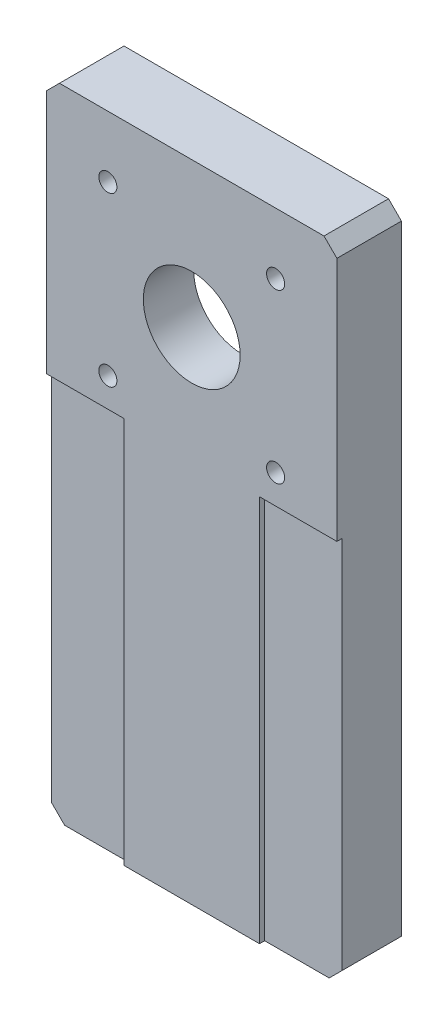
ISO-10303-21;
HEADER;
FILE_DESCRIPTION(('STEP AP214'),'2;1');
FILE_NAME('part.step','',(''),(''),'','','');
FILE_SCHEMA(('AUTOMOTIVE_DESIGN { 1 0 10303 214 1 1 1 1 }'));
ENDSEC;
DATA;
#1=APPLICATION_CONTEXT('core data for automotive mechanical design processes');
#2=APPLICATION_PROTOCOL_DEFINITION('international standard','automotive_design',2000,#1);
#3=PRODUCT_CONTEXT('',#1,'mechanical');
#4=PRODUCT('Part','Part','',(#3));
#5=PRODUCT_RELATED_PRODUCT_CATEGORY('part','',(#4));
#6=PRODUCT_DEFINITION_FORMATION('','',#4);
#7=PRODUCT_DEFINITION_CONTEXT('part definition',#1,'design');
#8=PRODUCT_DEFINITION('design','',#6,#7);
#9=PRODUCT_DEFINITION_SHAPE('','',#8);
#10=(LENGTH_UNIT() NAMED_UNIT(*) SI_UNIT(.MILLI.,.METRE.));
#11=(NAMED_UNIT(*) PLANE_ANGLE_UNIT() SI_UNIT($,.RADIAN.));
#12=(NAMED_UNIT(*) SI_UNIT($,.STERADIAN.) SOLID_ANGLE_UNIT());
#13=UNCERTAINTY_MEASURE_WITH_UNIT(LENGTH_MEASURE(1.E-05),#10,'distance_accuracy_value','');
#14=(GEOMETRIC_REPRESENTATION_CONTEXT(3) GLOBAL_UNCERTAINTY_ASSIGNED_CONTEXT((#13)) GLOBAL_UNIT_ASSIGNED_CONTEXT((#10,
#11,#12)) REPRESENTATION_CONTEXT('',''));
#15=CARTESIAN_POINT('',(0.,0.,0.));
#16=DIRECTION('',(0.,0.,1.));
#17=DIRECTION('',(1.,0.,0.));
#18=AXIS2_PLACEMENT_3D('',#15,#16,#17);
#19=CARTESIAN_POINT('',(22.5,77.5,0.));
#20=DIRECTION('',(0.,0.,1.));
#21=DIRECTION('',(1.,0.,0.));
#22=AXIS2_PLACEMENT_3D('',#19,#20,#21);
#23=CYLINDRICAL_SURFACE('',#22,7.5);
#24=CARTESIAN_POINT('',(22.5,77.5,10.));
#25=DIRECTION('',(0.,0.,1.));
#26=DIRECTION('',(1.,0.,0.));
#27=AXIS2_PLACEMENT_3D('',#24,#25,#26);
#28=CIRCLE('',#27,7.5);
#29=CARTESIAN_POINT('',(30.,77.5,10.));
#30=VERTEX_POINT('',#29);
#31=EDGE_CURVE('E208',#30,#30,#28,.T.);
#32=ORIENTED_EDGE('',*,*,#31,.T.);
#33=EDGE_LOOP('',(#32));
#34=FACE_BOUND('',#33,.T.);
#35=CARTESIAN_POINT('',(22.5,77.5,2.2));
#36=DIRECTION('',(0.,0.,-1.));
#37=DIRECTION('',(-1.,0.,0.));
#38=AXIS2_PLACEMENT_3D('',#35,#36,#37);
#39=CIRCLE('',#38,7.5);
#40=CARTESIAN_POINT('',(15.,77.5,2.2));
#41=VERTEX_POINT('',#40);
#42=EDGE_CURVE('E201',#41,#41,#39,.F.);
#43=ORIENTED_EDGE('',*,*,#42,.F.);
#44=EDGE_LOOP('',(#43));
#45=FACE_BOUND('',#44,.T.);
#46=ADVANCED_FACE('F39',(#34,#45),#23,.F.);
#47=CARTESIAN_POINT('',(0.,0.,10.));
#48=DIRECTION('',(1.,0.,0.));
#49=DIRECTION('',(0.,0.,-1.));
#50=AXIS2_PLACEMENT_3D('',#47,#48,#49);
#51=PLANE('',#50);
#52=DIRECTION('',(0.,-1.,0.));
#53=VECTOR('',#52,1.);
#54=CARTESIAN_POINT('',(0.,0.,0.));
#55=LINE('',#54,#53);
#56=CARTESIAN_POINT('',(0.,98.,0.));
#57=VERTEX_POINT('',#56);
#58=CARTESIAN_POINT('',(0.,2.00000000000002,0.));
#59=VERTEX_POINT('',#58);
#60=EDGE_CURVE('E232',#57,#59,#55,.T.);
#61=ORIENTED_EDGE('',*,*,#60,.T.);
#62=DIRECTION('',(0.,0.,1.));
#63=VECTOR('',#62,1.);
#64=CARTESIAN_POINT('',(0.,2.00000000000002,10.));
#65=LINE('',#64,#63);
#66=CARTESIAN_POINT('',(0.,2.00000000000002,9.2));
#67=VERTEX_POINT('',#66);
#68=EDGE_CURVE('E166',#59,#67,#65,.T.);
#69=ORIENTED_EDGE('',*,*,#68,.T.);
#70=DIRECTION('',(0.,-1.,0.));
#71=VECTOR('',#70,1.);
#72=CARTESIAN_POINT('',(0.,60.,9.2));
#73=LINE('',#72,#71);
#74=CARTESIAN_POINT('',(0.,60.,9.2));
#75=VERTEX_POINT('',#74);
#76=EDGE_CURVE('E145',#75,#67,#73,.T.);
#77=ORIENTED_EDGE('',*,*,#76,.F.);
#78=DIRECTION('',(0.,0.,-1.));
#79=VECTOR('',#78,1.);
#80=CARTESIAN_POINT('',(0.,60.,10.));
#81=LINE('',#80,#79);
#82=CARTESIAN_POINT('',(0.,60.,10.));
#83=VERTEX_POINT('',#82);
#84=EDGE_CURVE('E152',#83,#75,#81,.T.);
#85=ORIENTED_EDGE('',*,*,#84,.F.);
#86=DIRECTION('',(0.,-1.,0.));
#87=VECTOR('',#86,1.);
#88=CARTESIAN_POINT('',(0.,0.,10.));
#89=LINE('',#88,#87);
#90=CARTESIAN_POINT('',(0.,98.,10.));
#91=VERTEX_POINT('',#90);
#92=EDGE_CURVE('E233',#91,#83,#89,.T.);
#93=ORIENTED_EDGE('',*,*,#92,.F.);
#94=DIRECTION('',(0.,0.,-1.));
#95=VECTOR('',#94,1.);
#96=CARTESIAN_POINT('',(0.,98.,10.));
#97=LINE('',#96,#95);
#98=EDGE_CURVE('E266',#91,#57,#97,.T.);
#99=ORIENTED_EDGE('',*,*,#98,.T.);
#100=EDGE_LOOP('',(#61,#69,#77,#85,#93,#99));
#101=FACE_BOUND('',#100,.T.);
#102=ADVANCED_FACE('F164',(#101),#51,.F.);
#103=CARTESIAN_POINT('',(0.,0.,10.));
#104=DIRECTION('',(0.,1.,0.));
#105=DIRECTION('',(0.,0.,1.));
#106=AXIS2_PLACEMENT_3D('',#103,#104,#105);
#107=PLANE('',#106);
#108=DIRECTION('',(1.,0.,0.));
#109=VECTOR('',#108,1.);
#110=CARTESIAN_POINT('',(0.,0.,9.2));
#111=LINE('',#110,#109);
#112=CARTESIAN_POINT('',(2.,0.,9.2));
#113=VERTEX_POINT('',#112);
#114=CARTESIAN_POINT('',(12.,0.,9.2));
#115=VERTEX_POINT('',#114);
#116=EDGE_CURVE('E188',#113,#115,#111,.T.);
#117=ORIENTED_EDGE('',*,*,#116,.F.);
#118=DIRECTION('',(0.,0.,-1.));
#119=VECTOR('',#118,1.);
#120=CARTESIAN_POINT('',(2.,0.,10.));
#121=LINE('',#120,#119);
#122=CARTESIAN_POINT('',(2.,0.,0.));
#123=VERTEX_POINT('',#122);
#124=EDGE_CURVE('E255',#113,#123,#121,.T.);
#125=ORIENTED_EDGE('',*,*,#124,.T.);
#126=DIRECTION('',(1.,0.,0.));
#127=VECTOR('',#126,1.);
#128=CARTESIAN_POINT('',(0.,0.,0.));
#129=LINE('',#128,#127);
#130=CARTESIAN_POINT('',(43.,0.,0.));
#131=VERTEX_POINT('',#130);
#132=EDGE_CURVE('E245',#123,#131,#129,.T.);
#133=ORIENTED_EDGE('',*,*,#132,.T.);
#134=DIRECTION('',(0.,0.,1.));
#135=VECTOR('',#134,1.);
#136=CARTESIAN_POINT('',(43.,0.,10.));
#137=LINE('',#136,#135);
#138=CARTESIAN_POINT('',(43.,0.,9.2));
#139=VERTEX_POINT('',#138);
#140=EDGE_CURVE('E243',#131,#139,#137,.T.);
#141=ORIENTED_EDGE('',*,*,#140,.T.);
#142=DIRECTION('',(1.,0.,0.));
#143=VECTOR('',#142,1.);
#144=CARTESIAN_POINT('',(45.,0.,9.2));
#145=LINE('',#144,#143);
#146=CARTESIAN_POINT('',(33.,0.,9.2));
#147=VERTEX_POINT('',#146);
#148=EDGE_CURVE('E181',#147,#139,#145,.T.);
#149=ORIENTED_EDGE('',*,*,#148,.F.);
#150=DIRECTION('',(0.,0.,-1.));
#151=VECTOR('',#150,1.);
#152=CARTESIAN_POINT('',(33.,0.,10.));
#153=LINE('',#152,#151);
#154=CARTESIAN_POINT('',(33.,0.,10.));
#155=VERTEX_POINT('',#154);
#156=EDGE_CURVE('E184',#155,#147,#153,.T.);
#157=ORIENTED_EDGE('',*,*,#156,.F.);
#158=DIRECTION('',(1.,0.,0.));
#159=VECTOR('',#158,1.);
#160=CARTESIAN_POINT('',(0.,0.,10.));
#161=LINE('',#160,#159);
#162=CARTESIAN_POINT('',(12.,0.,10.));
#163=VERTEX_POINT('',#162);
#164=EDGE_CURVE('E235',#163,#155,#161,.T.);
#165=ORIENTED_EDGE('',*,*,#164,.F.);
#166=DIRECTION('',(0.,0.,1.));
#167=VECTOR('',#166,1.);
#168=CARTESIAN_POINT('',(12.,0.,10.));
#169=LINE('',#168,#167);
#170=EDGE_CURVE('E161',#115,#163,#169,.T.);
#171=ORIENTED_EDGE('',*,*,#170,.F.);
#172=EDGE_LOOP('',(#117,#125,#133,#141,#149,#157,#165,#171));
#173=FACE_BOUND('',#172,.T.);
#174=ADVANCED_FACE('F308',(#173),#107,.F.);
#175=CARTESIAN_POINT('',(45.,0.,10.));
#176=DIRECTION('',(-1.,0.,0.));
#177=DIRECTION('',(0.,0.,1.));
#178=AXIS2_PLACEMENT_3D('',#175,#176,#177);
#179=PLANE('',#178);
#180=DIRECTION('',(0.,-1.,0.));
#181=VECTOR('',#180,1.);
#182=CARTESIAN_POINT('',(45.,60.,9.2));
#183=LINE('',#182,#181);
#184=CARTESIAN_POINT('',(45.,60.,9.2));
#185=VERTEX_POINT('',#184);
#186=CARTESIAN_POINT('',(45.,2.,9.2));
#187=VERTEX_POINT('',#186);
#188=EDGE_CURVE('E178',#185,#187,#183,.T.);
#189=ORIENTED_EDGE('',*,*,#188,.T.);
#190=DIRECTION('',(0.,0.,-1.));
#191=VECTOR('',#190,1.);
#192=CARTESIAN_POINT('',(45.,2.,10.));
#193=LINE('',#192,#191);
#194=CARTESIAN_POINT('',(45.,2.,0.));
#195=VERTEX_POINT('',#194);
#196=EDGE_CURVE('E274',#187,#195,#193,.T.);
#197=ORIENTED_EDGE('',*,*,#196,.T.);
#198=DIRECTION('',(0.,1.,0.));
#199=VECTOR('',#198,1.);
#200=CARTESIAN_POINT('',(45.,0.,0.));
#201=LINE('',#200,#199);
#202=CARTESIAN_POINT('',(45.,98.,0.));
#203=VERTEX_POINT('',#202);
#204=EDGE_CURVE('E248',#195,#203,#201,.T.);
#205=ORIENTED_EDGE('',*,*,#204,.T.);
#206=DIRECTION('',(0.,0.,1.));
#207=VECTOR('',#206,1.);
#208=CARTESIAN_POINT('',(45.,98.,10.));
#209=LINE('',#208,#207);
#210=CARTESIAN_POINT('',(45.,98.,10.));
#211=VERTEX_POINT('',#210);
#212=EDGE_CURVE('E272',#203,#211,#209,.T.);
#213=ORIENTED_EDGE('',*,*,#212,.T.);
#214=DIRECTION('',(0.,1.,0.));
#215=VECTOR('',#214,1.);
#216=CARTESIAN_POINT('',(45.,0.,10.));
#217=LINE('',#216,#215);
#218=CARTESIAN_POINT('',(45.,60.,10.));
#219=VERTEX_POINT('',#218);
#220=EDGE_CURVE('E239',#219,#211,#217,.T.);
#221=ORIENTED_EDGE('',*,*,#220,.F.);
#222=DIRECTION('',(0.,0.,1.));
#223=VECTOR('',#222,1.);
#224=CARTESIAN_POINT('',(45.,60.,10.));
#225=LINE('',#224,#223);
#226=EDGE_CURVE('E185',#185,#219,#225,.T.);
#227=ORIENTED_EDGE('',*,*,#226,.F.);
#228=EDGE_LOOP('',(#189,#197,#205,#213,#221,#227));
#229=FACE_BOUND('',#228,.T.);
#230=ADVANCED_FACE('F298',(#229),#179,.F.);
#231=CARTESIAN_POINT('',(0.,100.,10.));
#232=DIRECTION('',(0.,-1.,0.));
#233=DIRECTION('',(0.,0.,-1.));
#234=AXIS2_PLACEMENT_3D('',#231,#232,#233);
#235=PLANE('',#234);
#236=DIRECTION('',(-1.,0.,0.));
#237=VECTOR('',#236,1.);
#238=CARTESIAN_POINT('',(0.,100.,10.));
#239=LINE('',#238,#237);
#240=CARTESIAN_POINT('',(43.,100.,10.));
#241=VERTEX_POINT('',#240);
#242=CARTESIAN_POINT('',(2.00000000000001,100.,10.));
#243=VERTEX_POINT('',#242);
#244=EDGE_CURVE('E241',#241,#243,#239,.T.);
#245=ORIENTED_EDGE('',*,*,#244,.F.);
#246=DIRECTION('',(0.,0.,-1.));
#247=VECTOR('',#246,1.);
#248=CARTESIAN_POINT('',(43.,100.,10.));
#249=LINE('',#248,#247);
#250=CARTESIAN_POINT('',(43.,100.,0.));
#251=VERTEX_POINT('',#250);
#252=EDGE_CURVE('E280',#241,#251,#249,.T.);
#253=ORIENTED_EDGE('',*,*,#252,.T.);
#254=DIRECTION('',(-1.,0.,0.));
#255=VECTOR('',#254,1.);
#256=CARTESIAN_POINT('',(0.,100.,0.));
#257=LINE('',#256,#255);
#258=CARTESIAN_POINT('',(2.00000000000001,100.,0.));
#259=VERTEX_POINT('',#258);
#260=EDGE_CURVE('E236',#251,#259,#257,.T.);
#261=ORIENTED_EDGE('',*,*,#260,.T.);
#262=DIRECTION('',(0.,0.,1.));
#263=VECTOR('',#262,1.);
#264=CARTESIAN_POINT('',(2.00000000000002,100.,10.));
#265=LINE('',#264,#263);
#266=EDGE_CURVE('E55',#259,#243,#265,.T.);
#267=ORIENTED_EDGE('',*,*,#266,.T.);
#268=EDGE_LOOP('',(#245,#253,#261,#267));
#269=FACE_BOUND('',#268,.T.);
#270=ADVANCED_FACE('F291',(#269),#235,.F.);
#271=CARTESIAN_POINT('',(0.,0.,10.));
#272=DIRECTION('',(0.,0.,-1.));
#273=DIRECTION('',(-1.,0.,0.));
#274=AXIS2_PLACEMENT_3D('',#271,#272,#273);
#275=PLANE('',#274);
#276=CARTESIAN_POINT('',(9.5,64.5,10.));
#277=DIRECTION('',(0.,0.,1.));
#278=DIRECTION('',(1.,0.,0.));
#279=AXIS2_PLACEMENT_3D('',#276,#277,#278);
#280=CIRCLE('',#279,1.4);
#281=CARTESIAN_POINT('',(10.9,64.5,10.));
#282=VERTEX_POINT('',#281);
#283=EDGE_CURVE('E224',#282,#282,#280,.T.);
#284=ORIENTED_EDGE('',*,*,#283,.F.);
#285=EDGE_LOOP('',(#284));
#286=FACE_BOUND('',#285,.T.);
#287=CARTESIAN_POINT('',(35.5,64.5,10.));
#288=DIRECTION('',(0.,0.,1.));
#289=DIRECTION('',(1.,0.,0.));
#290=AXIS2_PLACEMENT_3D('',#287,#288,#289);
#291=CIRCLE('',#290,1.4);
#292=CARTESIAN_POINT('',(36.9,64.5,10.));
#293=VERTEX_POINT('',#292);
#294=EDGE_CURVE('E218',#293,#293,#291,.T.);
#295=ORIENTED_EDGE('',*,*,#294,.F.);
#296=EDGE_LOOP('',(#295));
#297=FACE_BOUND('',#296,.T.);
#298=CARTESIAN_POINT('',(35.5,90.5,10.));
#299=DIRECTION('',(0.,0.,1.));
#300=DIRECTION('',(1.,0.,0.));
#301=AXIS2_PLACEMENT_3D('',#298,#299,#300);
#302=CIRCLE('',#301,1.4);
#303=CARTESIAN_POINT('',(36.9,90.5,10.));
#304=VERTEX_POINT('',#303);
#305=EDGE_CURVE('E212',#304,#304,#302,.T.);
#306=ORIENTED_EDGE('',*,*,#305,.F.);
#307=EDGE_LOOP('',(#306));
#308=FACE_BOUND('',#307,.T.);
#309=CARTESIAN_POINT('',(9.5,90.5,10.));
#310=DIRECTION('',(0.,0.,1.));
#311=DIRECTION('',(1.,0.,0.));
#312=AXIS2_PLACEMENT_3D('',#309,#310,#311);
#313=CIRCLE('',#312,1.4);
#314=CARTESIAN_POINT('',(10.9,90.5,10.));
#315=VERTEX_POINT('',#314);
#316=EDGE_CURVE('E205',#315,#315,#313,.T.);
#317=ORIENTED_EDGE('',*,*,#316,.F.);
#318=EDGE_LOOP('',(#317));
#319=FACE_BOUND('',#318,.T.);
#320=ORIENTED_EDGE('',*,*,#31,.F.);
#321=EDGE_LOOP('',(#320));
#322=FACE_BOUND('',#321,.T.);
#323=ORIENTED_EDGE('',*,*,#220,.T.);
#324=DIRECTION('',(0.707106781186548,-0.707106781186548,0.));
#325=VECTOR('',#324,1.);
#326=CARTESIAN_POINT('',(43.,100.,10.));
#327=LINE('',#326,#325);
#328=EDGE_CURVE('E11',#211,#241,#327,.F.);
#329=ORIENTED_EDGE('',*,*,#328,.T.);
#330=ORIENTED_EDGE('',*,*,#244,.T.);
#331=DIRECTION('',(0.707106781186552,0.707106781186543,0.));
#332=VECTOR('',#331,1.);
#333=CARTESIAN_POINT('',(0.,98.,10.));
#334=LINE('',#333,#332);
#335=EDGE_CURVE('E48',#243,#91,#334,.F.);
#336=ORIENTED_EDGE('',*,*,#335,.T.);
#337=ORIENTED_EDGE('',*,*,#92,.T.);
#338=DIRECTION('',(-1.,0.,0.));
#339=VECTOR('',#338,1.);
#340=CARTESIAN_POINT('',(0.,60.,10.));
#341=LINE('',#340,#339);
#342=CARTESIAN_POINT('',(12.,60.,10.));
#343=VERTEX_POINT('',#342);
#344=EDGE_CURVE('E158',#343,#83,#341,.T.);
#345=ORIENTED_EDGE('',*,*,#344,.F.);
#346=DIRECTION('',(0.,-1.,0.));
#347=VECTOR('',#346,1.);
#348=CARTESIAN_POINT('',(12.,60.,10.));
#349=LINE('',#348,#347);
#350=EDGE_CURVE('E168',#343,#163,#349,.T.);
#351=ORIENTED_EDGE('',*,*,#350,.T.);
#352=ORIENTED_EDGE('',*,*,#164,.T.);
#353=DIRECTION('',(0.,-1.,0.));
#354=VECTOR('',#353,1.);
#355=CARTESIAN_POINT('',(33.,60.,10.));
#356=LINE('',#355,#354);
#357=CARTESIAN_POINT('',(33.,60.,10.));
#358=VERTEX_POINT('',#357);
#359=EDGE_CURVE('E173',#358,#155,#356,.T.);
#360=ORIENTED_EDGE('',*,*,#359,.F.);
#361=DIRECTION('',(-1.,0.,0.));
#362=VECTOR('',#361,1.);
#363=CARTESIAN_POINT('',(45.,60.,10.));
#364=LINE('',#363,#362);
#365=EDGE_CURVE('E194',#219,#358,#364,.T.);
#366=ORIENTED_EDGE('',*,*,#365,.F.);
#367=EDGE_LOOP('',(#323,#329,#330,#336,#337,#345,#351,#352,#360,#366));
#368=FACE_BOUND('',#367,.T.);
#369=ADVANCED_FACE('F283',(#286,#297,#308,#319,#322,#368),#275,.F.);
#370=CARTESIAN_POINT('',(0.,0.,0.));
#371=DIRECTION('',(0.,0.,-1.));
#372=DIRECTION('',(-1.,0.,0.));
#373=AXIS2_PLACEMENT_3D('',#370,#371,#372);
#374=PLANE('',#373);
#375=CARTESIAN_POINT('',(22.5,77.5,0.));
#376=DIRECTION('',(0.,0.,-1.));
#377=DIRECTION('',(-1.,0.,0.));
#378=AXIS2_PLACEMENT_3D('',#375,#376,#377);
#379=CIRCLE('',#378,11.);
#380=CARTESIAN_POINT('',(11.5,77.5,0.));
#381=VERTEX_POINT('',#380);
#382=EDGE_CURVE('E202',#381,#381,#379,.T.);
#383=ORIENTED_EDGE('',*,*,#382,.F.);
#384=EDGE_LOOP('',(#383));
#385=FACE_BOUND('',#384,.T.);
#386=CARTESIAN_POINT('',(9.5,64.5,0.));
#387=DIRECTION('',(0.,0.,1.));
#388=DIRECTION('',(1.,0.,0.));
#389=AXIS2_PLACEMENT_3D('',#386,#387,#388);
#390=CIRCLE('',#389,1.4);
#391=CARTESIAN_POINT('',(10.9,64.5,0.));
#392=VERTEX_POINT('',#391);
#393=EDGE_CURVE('E227',#392,#392,#390,.T.);
#394=ORIENTED_EDGE('',*,*,#393,.T.);
#395=EDGE_LOOP('',(#394));
#396=FACE_BOUND('',#395,.T.);
#397=CARTESIAN_POINT('',(35.5,64.5,0.));
#398=DIRECTION('',(0.,0.,1.));
#399=DIRECTION('',(1.,0.,0.));
#400=AXIS2_PLACEMENT_3D('',#397,#398,#399);
#401=CIRCLE('',#400,1.4);
#402=CARTESIAN_POINT('',(36.9,64.5,0.));
#403=VERTEX_POINT('',#402);
#404=EDGE_CURVE('E221',#403,#403,#401,.T.);
#405=ORIENTED_EDGE('',*,*,#404,.T.);
#406=EDGE_LOOP('',(#405));
#407=FACE_BOUND('',#406,.T.);
#408=CARTESIAN_POINT('',(35.5,90.5,0.));
#409=DIRECTION('',(0.,0.,1.));
#410=DIRECTION('',(1.,0.,0.));
#411=AXIS2_PLACEMENT_3D('',#408,#409,#410);
#412=CIRCLE('',#411,1.4);
#413=CARTESIAN_POINT('',(36.9,90.5,0.));
#414=VERTEX_POINT('',#413);
#415=EDGE_CURVE('E215',#414,#414,#412,.T.);
#416=ORIENTED_EDGE('',*,*,#415,.T.);
#417=EDGE_LOOP('',(#416));
#418=FACE_BOUND('',#417,.T.);
#419=CARTESIAN_POINT('',(9.5,90.5,0.));
#420=DIRECTION('',(0.,0.,1.));
#421=DIRECTION('',(1.,0.,0.));
#422=AXIS2_PLACEMENT_3D('',#419,#420,#421);
#423=CIRCLE('',#422,1.4);
#424=CARTESIAN_POINT('',(10.9,90.5,0.));
#425=VERTEX_POINT('',#424);
#426=EDGE_CURVE('E209',#425,#425,#423,.T.);
#427=ORIENTED_EDGE('',*,*,#426,.T.);
#428=EDGE_LOOP('',(#427));
#429=FACE_BOUND('',#428,.T.);
#430=ORIENTED_EDGE('',*,*,#132,.F.);
#431=DIRECTION('',(0.707106781186545,-0.70710678118655,0.));
#432=VECTOR('',#431,1.);
#433=CARTESIAN_POINT('',(1.00000000000001,1.,0.));
#434=LINE('',#433,#432);
#435=EDGE_CURVE('E264',#123,#59,#434,.F.);
#436=ORIENTED_EDGE('',*,*,#435,.T.);
#437=ORIENTED_EDGE('',*,*,#60,.F.);
#438=DIRECTION('',(-0.707106781186552,-0.707106781186543,0.));
#439=VECTOR('',#438,1.);
#440=CARTESIAN_POINT('',(-49.,49.0000000000007,0.));
#441=LINE('',#440,#439);
#442=EDGE_CURVE('E258',#57,#259,#441,.F.);
#443=ORIENTED_EDGE('',*,*,#442,.T.);
#444=ORIENTED_EDGE('',*,*,#260,.F.);
#445=DIRECTION('',(-0.707106781186548,0.707106781186548,0.));
#446=VECTOR('',#445,1.);
#447=CARTESIAN_POINT('',(71.5,71.5,0.));
#448=LINE('',#447,#446);
#449=EDGE_CURVE('E260',#251,#203,#448,.F.);
#450=ORIENTED_EDGE('',*,*,#449,.T.);
#451=ORIENTED_EDGE('',*,*,#204,.F.);
#452=DIRECTION('',(0.70710678118655,0.707106781186545,0.));
#453=VECTOR('',#452,1.);
#454=CARTESIAN_POINT('',(21.4999999999998,-21.5,0.));
#455=LINE('',#454,#453);
#456=EDGE_CURVE('E262',#195,#131,#455,.F.);
#457=ORIENTED_EDGE('',*,*,#456,.T.);
#458=EDGE_LOOP('',(#430,#436,#437,#443,#444,#450,#451,#457));
#459=FACE_BOUND('',#458,.T.);
#460=ADVANCED_FACE('F290',(#385,#396,#407,#418,#429,#459),#374,.T.);
#461=CARTESIAN_POINT('',(9.5,90.5,0.));
#462=DIRECTION('',(0.,0.,1.));
#463=DIRECTION('',(1.,0.,0.));
#464=AXIS2_PLACEMENT_3D('',#461,#462,#463);
#465=CYLINDRICAL_SURFACE('',#464,1.4);
#466=ORIENTED_EDGE('',*,*,#426,.F.);
#467=EDGE_LOOP('',(#466));
#468=FACE_BOUND('',#467,.T.);
#469=ORIENTED_EDGE('',*,*,#316,.T.);
#470=EDGE_LOOP('',(#469));
#471=FACE_BOUND('',#470,.T.);
#472=ADVANCED_FACE('F359',(#468,#471),#465,.F.);
#473=CARTESIAN_POINT('',(35.5,90.5,0.));
#474=DIRECTION('',(0.,0.,1.));
#475=DIRECTION('',(1.,0.,0.));
#476=AXIS2_PLACEMENT_3D('',#473,#474,#475);
#477=CYLINDRICAL_SURFACE('',#476,1.4);
#478=ORIENTED_EDGE('',*,*,#415,.F.);
#479=EDGE_LOOP('',(#478));
#480=FACE_BOUND('',#479,.T.);
#481=ORIENTED_EDGE('',*,*,#305,.T.);
#482=EDGE_LOOP('',(#481));
#483=FACE_BOUND('',#482,.T.);
#484=ADVANCED_FACE('F512',(#480,#483),#477,.F.);
#485=CARTESIAN_POINT('',(35.5,64.5,0.));
#486=DIRECTION('',(0.,0.,1.));
#487=DIRECTION('',(1.,0.,0.));
#488=AXIS2_PLACEMENT_3D('',#485,#486,#487);
#489=CYLINDRICAL_SURFACE('',#488,1.4);
#490=ORIENTED_EDGE('',*,*,#404,.F.);
#491=EDGE_LOOP('',(#490));
#492=FACE_BOUND('',#491,.T.);
#493=ORIENTED_EDGE('',*,*,#294,.T.);
#494=EDGE_LOOP('',(#493));
#495=FACE_BOUND('',#494,.T.);
#496=ADVANCED_FACE('F503',(#492,#495),#489,.F.);
#497=CARTESIAN_POINT('',(9.5,64.5,0.));
#498=DIRECTION('',(0.,0.,1.));
#499=DIRECTION('',(1.,0.,0.));
#500=AXIS2_PLACEMENT_3D('',#497,#498,#499);
#501=CYLINDRICAL_SURFACE('',#500,1.4);
#502=ORIENTED_EDGE('',*,*,#393,.F.);
#503=EDGE_LOOP('',(#502));
#504=FACE_BOUND('',#503,.T.);
#505=ORIENTED_EDGE('',*,*,#283,.T.);
#506=EDGE_LOOP('',(#505));
#507=FACE_BOUND('',#506,.T.);
#508=ADVANCED_FACE('F352',(#504,#507),#501,.F.);
#509=CARTESIAN_POINT('',(22.5,77.5,2.2));
#510=DIRECTION('',(0.,0.,-1.));
#511=DIRECTION('',(-1.,0.,0.));
#512=AXIS2_PLACEMENT_3D('',#509,#510,#511);
#513=PLANE('',#512);
#514=CARTESIAN_POINT('',(22.5,77.5,2.2));
#515=DIRECTION('',(0.,0.,-1.));
#516=DIRECTION('',(-1.,0.,0.));
#517=AXIS2_PLACEMENT_3D('',#514,#515,#516);
#518=CIRCLE('',#517,11.);
#519=CARTESIAN_POINT('',(11.5,77.5,2.2));
#520=VERTEX_POINT('',#519);
#521=EDGE_CURVE('E198',#520,#520,#518,.T.);
#522=ORIENTED_EDGE('',*,*,#521,.T.);
#523=EDGE_LOOP('',(#522));
#524=FACE_BOUND('',#523,.T.);
#525=ORIENTED_EDGE('',*,*,#42,.T.);
#526=EDGE_LOOP('',(#525));
#527=FACE_BOUND('',#526,.T.);
#528=ADVANCED_FACE('F478',(#524,#527),#513,.T.);
#529=CARTESIAN_POINT('',(22.5,77.5,2.2));
#530=DIRECTION('',(0.,0.,-1.));
#531=DIRECTION('',(-1.,0.,0.));
#532=AXIS2_PLACEMENT_3D('',#529,#530,#531);
#533=CYLINDRICAL_SURFACE('',#532,11.);
#534=ORIENTED_EDGE('',*,*,#521,.F.);
#535=EDGE_LOOP('',(#534));
#536=FACE_BOUND('',#535,.T.);
#537=ORIENTED_EDGE('',*,*,#382,.T.);
#538=EDGE_LOOP('',(#537));
#539=FACE_BOUND('',#538,.T.);
#540=ADVANCED_FACE('F420',(#536,#539),#533,.F.);
#541=CARTESIAN_POINT('',(45.,60.,9.2));
#542=DIRECTION('',(0.,0.,-1.));
#543=DIRECTION('',(-1.,0.,0.));
#544=AXIS2_PLACEMENT_3D('',#541,#542,#543);
#545=PLANE('',#544);
#546=ORIENTED_EDGE('',*,*,#148,.T.);
#547=DIRECTION('',(-0.70710678118655,-0.707106781186545,0.));
#548=VECTOR('',#547,1.);
#549=CARTESIAN_POINT('',(45.,2.,9.2));
#550=LINE('',#549,#548);
#551=EDGE_CURVE('E277',#139,#187,#550,.F.);
#552=ORIENTED_EDGE('',*,*,#551,.T.);
#553=ORIENTED_EDGE('',*,*,#188,.F.);
#554=DIRECTION('',(1.,0.,0.));
#555=VECTOR('',#554,1.);
#556=CARTESIAN_POINT('',(45.,60.,9.2));
#557=LINE('',#556,#555);
#558=CARTESIAN_POINT('',(33.,60.,9.2));
#559=VERTEX_POINT('',#558);
#560=EDGE_CURVE('E175',#559,#185,#557,.T.);
#561=ORIENTED_EDGE('',*,*,#560,.F.);
#562=DIRECTION('',(0.,-1.,0.));
#563=VECTOR('',#562,1.);
#564=CARTESIAN_POINT('',(33.,60.,9.2));
#565=LINE('',#564,#563);
#566=EDGE_CURVE('E176',#559,#147,#565,.T.);
#567=ORIENTED_EDGE('',*,*,#566,.T.);
#568=EDGE_LOOP('',(#546,#552,#553,#561,#567));
#569=FACE_BOUND('',#568,.T.);
#570=ADVANCED_FACE('F327',(#569),#545,.F.);
#571=CARTESIAN_POINT('',(33.,60.,10.));
#572=DIRECTION('',(-1.,0.,0.));
#573=DIRECTION('',(0.,0.,1.));
#574=AXIS2_PLACEMENT_3D('',#571,#572,#573);
#575=PLANE('',#574);
#576=ORIENTED_EDGE('',*,*,#156,.T.);
#577=ORIENTED_EDGE('',*,*,#566,.F.);
#578=DIRECTION('',(0.,0.,-1.));
#579=VECTOR('',#578,1.);
#580=CARTESIAN_POINT('',(33.,60.,10.));
#581=LINE('',#580,#579);
#582=EDGE_CURVE('E191',#358,#559,#581,.T.);
#583=ORIENTED_EDGE('',*,*,#582,.F.);
#584=ORIENTED_EDGE('',*,*,#359,.T.);
#585=EDGE_LOOP('',(#576,#577,#583,#584));
#586=FACE_BOUND('',#585,.T.);
#587=ADVANCED_FACE('F325',(#586),#575,.F.);
#588=CARTESIAN_POINT('',(0.,60.,0.));
#589=DIRECTION('',(0.,1.,0.));
#590=DIRECTION('',(0.,0.,1.));
#591=AXIS2_PLACEMENT_3D('',#588,#589,#590);
#592=PLANE('',#591);
#593=ORIENTED_EDGE('',*,*,#226,.T.);
#594=ORIENTED_EDGE('',*,*,#365,.T.);
#595=ORIENTED_EDGE('',*,*,#582,.T.);
#596=ORIENTED_EDGE('',*,*,#560,.T.);
#597=EDGE_LOOP('',(#593,#594,#595,#596));
#598=FACE_BOUND('',#597,.T.);
#599=ADVANCED_FACE('F330',(#598),#592,.F.);
#600=CARTESIAN_POINT('',(12.,60.,10.));
#601=DIRECTION('',(1.,0.,0.));
#602=DIRECTION('',(0.,0.,-1.));
#603=AXIS2_PLACEMENT_3D('',#600,#601,#602);
#604=PLANE('',#603);
#605=ORIENTED_EDGE('',*,*,#170,.T.);
#606=ORIENTED_EDGE('',*,*,#350,.F.);
#607=DIRECTION('',(0.,0.,1.));
#608=VECTOR('',#607,1.);
#609=CARTESIAN_POINT('',(12.,60.,10.));
#610=LINE('',#609,#608);
#611=CARTESIAN_POINT('',(12.,60.,9.2));
#612=VERTEX_POINT('',#611);
#613=EDGE_CURVE('E151',#612,#343,#610,.T.);
#614=ORIENTED_EDGE('',*,*,#613,.F.);
#615=DIRECTION('',(0.,-1.,0.));
#616=VECTOR('',#615,1.);
#617=CARTESIAN_POINT('',(12.,60.,9.2));
#618=LINE('',#617,#616);
#619=EDGE_CURVE('E148',#612,#115,#618,.T.);
#620=ORIENTED_EDGE('',*,*,#619,.T.);
#621=EDGE_LOOP('',(#605,#606,#614,#620));
#622=FACE_BOUND('',#621,.T.);
#623=ADVANCED_FACE('F316',(#622),#604,.F.);
#624=CARTESIAN_POINT('',(0.,60.,9.2));
#625=DIRECTION('',(0.,0.,-1.));
#626=DIRECTION('',(-1.,0.,0.));
#627=AXIS2_PLACEMENT_3D('',#624,#625,#626);
#628=PLANE('',#627);
#629=ORIENTED_EDGE('',*,*,#76,.T.);
#630=DIRECTION('',(-0.707106781186545,0.70710678118655,0.));
#631=VECTOR('',#630,1.);
#632=CARTESIAN_POINT('',(2.,0.,9.2));
#633=LINE('',#632,#631);
#634=EDGE_CURVE('E270',#67,#113,#633,.F.);
#635=ORIENTED_EDGE('',*,*,#634,.T.);
#636=ORIENTED_EDGE('',*,*,#116,.T.);
#637=ORIENTED_EDGE('',*,*,#619,.F.);
#638=DIRECTION('',(1.,0.,0.));
#639=VECTOR('',#638,1.);
#640=CARTESIAN_POINT('',(0.,60.,9.2));
#641=LINE('',#640,#639);
#642=EDGE_CURVE('E141',#75,#612,#641,.T.);
#643=ORIENTED_EDGE('',*,*,#642,.F.);
#644=EDGE_LOOP('',(#629,#635,#636,#637,#643));
#645=FACE_BOUND('',#644,.T.);
#646=ADVANCED_FACE('F143',(#645),#628,.F.);
#647=CARTESIAN_POINT('',(0.,60.,0.));
#648=DIRECTION('',(0.,-1.,0.));
#649=DIRECTION('',(0.,0.,-1.));
#650=AXIS2_PLACEMENT_3D('',#647,#648,#649);
#651=PLANE('',#650);
#652=ORIENTED_EDGE('',*,*,#84,.T.);
#653=ORIENTED_EDGE('',*,*,#642,.T.);
#654=ORIENTED_EDGE('',*,*,#613,.T.);
#655=ORIENTED_EDGE('',*,*,#344,.T.);
#656=EDGE_LOOP('',(#652,#653,#654,#655));
#657=FACE_BOUND('',#656,.T.);
#658=ADVANCED_FACE('F156',(#657),#651,.T.);
#659=CARTESIAN_POINT('',(2.,0.,10.));
#660=DIRECTION('',(0.70710678118655,0.707106781186545,0.));
#661=DIRECTION('',(0.,0.,-1.));
#662=AXIS2_PLACEMENT_3D('',#659,#660,#661);
#663=PLANE('',#662);
#664=ORIENTED_EDGE('',*,*,#634,.F.);
#665=ORIENTED_EDGE('',*,*,#68,.F.);
#666=ORIENTED_EDGE('',*,*,#435,.F.);
#667=ORIENTED_EDGE('',*,*,#124,.F.);
#668=EDGE_LOOP('',(#664,#665,#666,#667));
#669=FACE_BOUND('',#668,.T.);
#670=ADVANCED_FACE('F313',(#669),#663,.F.);
#671=CARTESIAN_POINT('',(45.,2.,10.));
#672=DIRECTION('',(-0.707106781186545,0.70710678118655,0.));
#673=DIRECTION('',(0.,0.,-1.));
#674=AXIS2_PLACEMENT_3D('',#671,#672,#673);
#675=PLANE('',#674);
#676=ORIENTED_EDGE('',*,*,#551,.F.);
#677=ORIENTED_EDGE('',*,*,#140,.F.);
#678=ORIENTED_EDGE('',*,*,#456,.F.);
#679=ORIENTED_EDGE('',*,*,#196,.F.);
#680=EDGE_LOOP('',(#676,#677,#678,#679));
#681=FACE_BOUND('',#680,.T.);
#682=ADVANCED_FACE('F304',(#681),#675,.F.);
#683=CARTESIAN_POINT('',(43.,100.,10.));
#684=DIRECTION('',(-0.707106781186547,-0.707106781186547,0.));
#685=DIRECTION('',(0.,0.,-1.));
#686=AXIS2_PLACEMENT_3D('',#683,#684,#685);
#687=PLANE('',#686);
#688=ORIENTED_EDGE('',*,*,#328,.F.);
#689=ORIENTED_EDGE('',*,*,#212,.F.);
#690=ORIENTED_EDGE('',*,*,#449,.F.);
#691=ORIENTED_EDGE('',*,*,#252,.F.);
#692=EDGE_LOOP('',(#688,#689,#690,#691));
#693=FACE_BOUND('',#692,.T.);
#694=ADVANCED_FACE('F294',(#693),#687,.F.);
#695=CARTESIAN_POINT('',(0.,98.,10.));
#696=DIRECTION('',(0.707106781186543,-0.707106781186552,0.));
#697=DIRECTION('',(0.,0.,-1.));
#698=AXIS2_PLACEMENT_3D('',#695,#696,#697);
#699=PLANE('',#698);
#700=ORIENTED_EDGE('',*,*,#335,.F.);
#701=ORIENTED_EDGE('',*,*,#266,.F.);
#702=ORIENTED_EDGE('',*,*,#442,.F.);
#703=ORIENTED_EDGE('',*,*,#98,.F.);
#704=EDGE_LOOP('',(#700,#701,#702,#703));
#705=FACE_BOUND('',#704,.T.);
#706=ADVANCED_FACE('F42',(#705),#699,.F.);
#707=CLOSED_SHELL('',(#46,#102,#174,#230,#270,#369,#460,#472,#484,#496,#508,#528,#540,#570,#587,
#599,#623,#646,#658,#670,#682,#694,#706));
#708=MANIFOLD_SOLID_BREP('B2',#707);
#709=ADVANCED_BREP_SHAPE_REPRESENTATION('',(#18,#708),#14);
#710=SHAPE_DEFINITION_REPRESENTATION(#9,#709);
ENDSEC;
END-ISO-10303-21;
